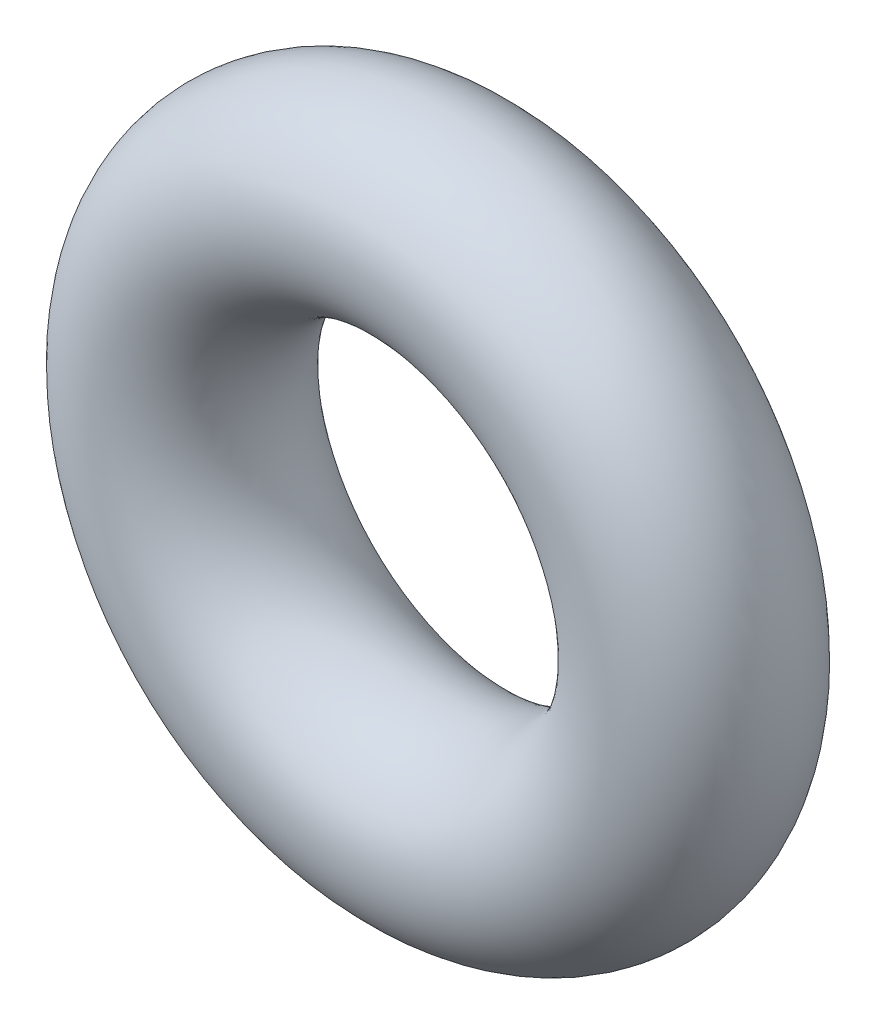
ISO-10303-21;
HEADER;
FILE_DESCRIPTION(('STEP AP214'),'2;1');
FILE_NAME('part.step','',(''),(''),'','','');
FILE_SCHEMA(('AUTOMOTIVE_DESIGN { 1 0 10303 214 1 1 1 1 }'));
ENDSEC;
DATA;
#1=APPLICATION_CONTEXT('core data for automotive mechanical design processes');
#2=APPLICATION_PROTOCOL_DEFINITION('international standard','automotive_design',2000,#1);
#3=PRODUCT_CONTEXT('',#1,'mechanical');
#4=PRODUCT('Part','Part','',(#3));
#5=PRODUCT_RELATED_PRODUCT_CATEGORY('part','',(#4));
#6=PRODUCT_DEFINITION_FORMATION('','',#4);
#7=PRODUCT_DEFINITION_CONTEXT('part definition',#1,'design');
#8=PRODUCT_DEFINITION('design','',#6,#7);
#9=PRODUCT_DEFINITION_SHAPE('','',#8);
#10=(LENGTH_UNIT() NAMED_UNIT(*) SI_UNIT(.MILLI.,.METRE.));
#11=(NAMED_UNIT(*) PLANE_ANGLE_UNIT() SI_UNIT($,.RADIAN.));
#12=(NAMED_UNIT(*) SI_UNIT($,.STERADIAN.) SOLID_ANGLE_UNIT());
#13=UNCERTAINTY_MEASURE_WITH_UNIT(LENGTH_MEASURE(1.E-05),#10,'distance_accuracy_value','');
#14=(GEOMETRIC_REPRESENTATION_CONTEXT(3) GLOBAL_UNCERTAINTY_ASSIGNED_CONTEXT((#13)) GLOBAL_UNIT_ASSIGNED_CONTEXT((#10,
#11,#12)) REPRESENTATION_CONTEXT('',''));
#15=CARTESIAN_POINT('',(0.,0.,0.));
#16=DIRECTION('',(0.,0.,1.));
#17=DIRECTION('',(1.,0.,0.));
#18=AXIS2_PLACEMENT_3D('',#15,#16,#17);
#19=CARTESIAN_POINT('',(0.,0.,0.));
#20=DIRECTION('',(0.,0.,-1.));
#21=DIRECTION('',(-1.,0.,0.));
#22=AXIS2_PLACEMENT_3D('',#19,#20,#21);
#23=TOROIDAL_SURFACE('',#22,2.,0.75);
#24=CARTESIAN_POINT('',(-2.75,0.,0.));
#25=VERTEX_POINT('',#24);
#26=VERTEX_LOOP('',#25);
#27=FACE_BOUND('',#26,.T.);
#28=ADVANCED_FACE('F32',(#27),#23,.T.);
#29=CLOSED_SHELL('',(#28));
#30=MANIFOLD_SOLID_BREP('B2',#29);
#31=ADVANCED_BREP_SHAPE_REPRESENTATION('',(#18,#30),#14);
#32=SHAPE_DEFINITION_REPRESENTATION(#9,#31);
ENDSEC;
END-ISO-10303-21;
